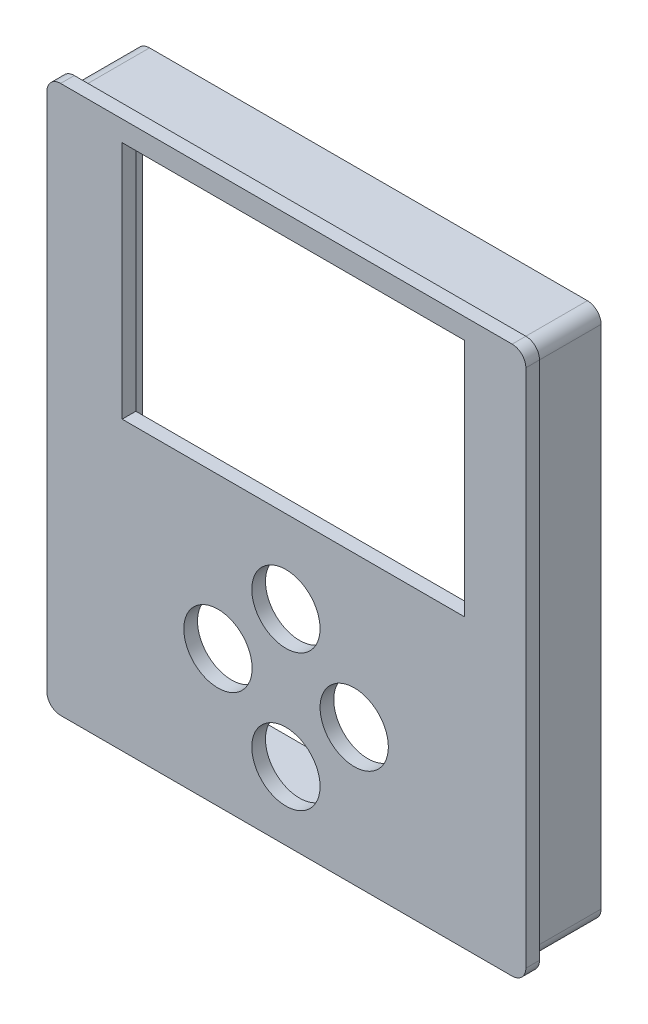
ISO-10303-21;
HEADER;
FILE_DESCRIPTION(('STEP AP214'),'2;1');
FILE_NAME('part.step','',(''),(''),'','','');
FILE_SCHEMA(('AUTOMOTIVE_DESIGN { 1 0 10303 214 1 1 1 1 }'));
ENDSEC;
DATA;
#1=APPLICATION_CONTEXT('core data for automotive mechanical design processes');
#2=APPLICATION_PROTOCOL_DEFINITION('international standard','automotive_design',2000,#1);
#3=PRODUCT_CONTEXT('',#1,'mechanical');
#4=PRODUCT('Part','Part','',(#3));
#5=PRODUCT_RELATED_PRODUCT_CATEGORY('part','',(#4));
#6=PRODUCT_DEFINITION_FORMATION('','',#4);
#7=PRODUCT_DEFINITION_CONTEXT('part definition',#1,'design');
#8=PRODUCT_DEFINITION('design','',#6,#7);
#9=PRODUCT_DEFINITION_SHAPE('','',#8);
#10=(LENGTH_UNIT() NAMED_UNIT(*) SI_UNIT(.MILLI.,.METRE.));
#11=(NAMED_UNIT(*) PLANE_ANGLE_UNIT() SI_UNIT($,.RADIAN.));
#12=(NAMED_UNIT(*) SI_UNIT($,.STERADIAN.) SOLID_ANGLE_UNIT());
#13=UNCERTAINTY_MEASURE_WITH_UNIT(LENGTH_MEASURE(1.E-05),#10,'distance_accuracy_value','');
#14=(GEOMETRIC_REPRESENTATION_CONTEXT(3) GLOBAL_UNCERTAINTY_ASSIGNED_CONTEXT((#13)) GLOBAL_UNIT_ASSIGNED_CONTEXT((#10,
#11,#12)) REPRESENTATION_CONTEXT('',''));
#15=CARTESIAN_POINT('',(0.,0.,0.));
#16=DIRECTION('',(0.,0.,1.));
#17=DIRECTION('',(1.,0.,0.));
#18=AXIS2_PLACEMENT_3D('',#15,#16,#17);
#19=CARTESIAN_POINT('',(88.9,0.,2.54));
#20=DIRECTION('',(1.,0.,0.));
#21=DIRECTION('',(0.,1.,0.));
#22=AXIS2_PLACEMENT_3D('',#19,#20,#21);
#23=PLANE('',#22);
#24=DIRECTION('',(0.,-1.,0.));
#25=VECTOR('',#24,1.);
#26=CARTESIAN_POINT('',(88.9,0.,0.));
#27=LINE('',#26,#25);
#28=CARTESIAN_POINT('',(88.9,99.06,0.));
#29=VERTEX_POINT('',#28);
#30=CARTESIAN_POINT('',(88.9,2.54000000000002,0.));
#31=VERTEX_POINT('',#30);
#32=EDGE_CURVE('E504',#29,#31,#27,.T.);
#33=ORIENTED_EDGE('',*,*,#32,.F.);
#34=DIRECTION('',(0.,0.,-1.));
#35=VECTOR('',#34,1.);
#36=CARTESIAN_POINT('',(88.9,99.06,2.54));
#37=LINE('',#36,#35);
#38=CARTESIAN_POINT('',(88.9,99.06,2.54));
#39=VERTEX_POINT('',#38);
#40=EDGE_CURVE('E11',#39,#29,#37,.T.);
#41=ORIENTED_EDGE('',*,*,#40,.F.);
#42=DIRECTION('',(0.,-1.,0.));
#43=VECTOR('',#42,1.);
#44=CARTESIAN_POINT('',(88.9,0.,2.54));
#45=LINE('',#44,#43);
#46=CARTESIAN_POINT('',(88.9,2.54000000000002,2.54));
#47=VERTEX_POINT('',#46);
#48=EDGE_CURVE('E443',#39,#47,#45,.T.);
#49=ORIENTED_EDGE('',*,*,#48,.T.);
#50=DIRECTION('',(0.,0.,-1.));
#51=VECTOR('',#50,1.);
#52=CARTESIAN_POINT('',(88.9,2.54000000000002,2.54));
#53=LINE('',#52,#51);
#54=EDGE_CURVE('E535',#47,#31,#53,.T.);
#55=ORIENTED_EDGE('',*,*,#54,.T.);
#56=EDGE_LOOP('',(#33,#41,#49,#55));
#57=FACE_BOUND('',#56,.T.);
#58=ADVANCED_FACE('F40',(#57),#23,.T.);
#59=CARTESIAN_POINT('',(86.36,99.06,2.54));
#60=DIRECTION('',(0.,0.,-1.));
#61=DIRECTION('',(-1.,0.,0.));
#62=AXIS2_PLACEMENT_3D('',#59,#60,#61);
#63=CYLINDRICAL_SURFACE('',#62,2.54);
#64=CARTESIAN_POINT('',(86.36,99.06,0.));
#65=DIRECTION('',(0.,0.,1.));
#66=DIRECTION('',(1.,0.,0.));
#67=AXIS2_PLACEMENT_3D('',#64,#65,#66);
#68=CIRCLE('',#67,2.54);
#69=CARTESIAN_POINT('',(86.36,101.6,0.));
#70=VERTEX_POINT('',#69);
#71=EDGE_CURVE('E508',#29,#70,#68,.T.);
#72=ORIENTED_EDGE('',*,*,#71,.T.);
#73=DIRECTION('',(0.,0.,-1.));
#74=VECTOR('',#73,1.);
#75=CARTESIAN_POINT('',(86.36,101.6,2.54));
#76=LINE('',#75,#74);
#77=CARTESIAN_POINT('',(86.36,101.6,2.54));
#78=VERTEX_POINT('',#77);
#79=EDGE_CURVE('E50',#78,#70,#76,.T.);
#80=ORIENTED_EDGE('',*,*,#79,.F.);
#81=CARTESIAN_POINT('',(86.36,99.06,2.54));
#82=DIRECTION('',(0.,0.,1.));
#83=DIRECTION('',(1.,0.,0.));
#84=AXIS2_PLACEMENT_3D('',#81,#82,#83);
#85=CIRCLE('',#84,2.54);
#86=EDGE_CURVE('E447',#39,#78,#85,.T.);
#87=ORIENTED_EDGE('',*,*,#86,.F.);
#88=ORIENTED_EDGE('',*,*,#40,.T.);
#89=EDGE_LOOP('',(#72,#80,#87,#88));
#90=FACE_BOUND('',#89,.T.);
#91=ADVANCED_FACE('F599',(#90),#63,.T.);
#92=CARTESIAN_POINT('',(0.,101.6,2.54));
#93=DIRECTION('',(0.,1.,0.));
#94=DIRECTION('',(0.,0.,1.));
#95=AXIS2_PLACEMENT_3D('',#92,#93,#94);
#96=PLANE('',#95);
#97=DIRECTION('',(1.,0.,0.));
#98=VECTOR('',#97,1.);
#99=CARTESIAN_POINT('',(0.,101.6,0.));
#100=LINE('',#99,#98);
#101=CARTESIAN_POINT('',(2.54000000000002,101.6,0.));
#102=VERTEX_POINT('',#101);
#103=EDGE_CURVE('E512',#102,#70,#100,.T.);
#104=ORIENTED_EDGE('',*,*,#103,.F.);
#105=DIRECTION('',(0.,0.,-1.));
#106=VECTOR('',#105,1.);
#107=CARTESIAN_POINT('',(2.54000000000002,101.6,2.54));
#108=LINE('',#107,#106);
#109=CARTESIAN_POINT('',(2.54000000000002,101.6,2.54));
#110=VERTEX_POINT('',#109);
#111=EDGE_CURVE('E551',#110,#102,#108,.T.);
#112=ORIENTED_EDGE('',*,*,#111,.F.);
#113=DIRECTION('',(1.,0.,0.));
#114=VECTOR('',#113,1.);
#115=CARTESIAN_POINT('',(0.,101.6,2.54));
#116=LINE('',#115,#114);
#117=EDGE_CURVE('E450',#110,#78,#116,.T.);
#118=ORIENTED_EDGE('',*,*,#117,.T.);
#119=ORIENTED_EDGE('',*,*,#79,.T.);
#120=EDGE_LOOP('',(#104,#112,#118,#119));
#121=FACE_BOUND('',#120,.T.);
#122=ADVANCED_FACE('F605',(#121),#96,.T.);
#123=CARTESIAN_POINT('',(2.54,99.06,2.54));
#124=DIRECTION('',(0.,0.,-1.));
#125=DIRECTION('',(-1.,0.,0.));
#126=AXIS2_PLACEMENT_3D('',#123,#124,#125);
#127=CYLINDRICAL_SURFACE('',#126,2.54);
#128=CARTESIAN_POINT('',(2.54,99.06,0.));
#129=DIRECTION('',(0.,0.,1.));
#130=DIRECTION('',(1.,0.,0.));
#131=AXIS2_PLACEMENT_3D('',#128,#129,#130);
#132=CIRCLE('',#131,2.54);
#133=CARTESIAN_POINT('',(0.,99.06,0.));
#134=VERTEX_POINT('',#133);
#135=EDGE_CURVE('E516',#102,#134,#132,.T.);
#136=ORIENTED_EDGE('',*,*,#135,.T.);
#137=DIRECTION('',(0.,0.,-1.));
#138=VECTOR('',#137,1.);
#139=CARTESIAN_POINT('',(0.,99.06,2.54));
#140=LINE('',#139,#138);
#141=CARTESIAN_POINT('',(0.,99.06,2.54));
#142=VERTEX_POINT('',#141);
#143=EDGE_CURVE('E548',#142,#134,#140,.T.);
#144=ORIENTED_EDGE('',*,*,#143,.F.);
#145=CARTESIAN_POINT('',(2.54,99.06,2.54));
#146=DIRECTION('',(0.,0.,1.));
#147=DIRECTION('',(1.,0.,0.));
#148=AXIS2_PLACEMENT_3D('',#145,#146,#147);
#149=CIRCLE('',#148,2.54);
#150=EDGE_CURVE('E454',#110,#142,#149,.T.);
#151=ORIENTED_EDGE('',*,*,#150,.F.);
#152=ORIENTED_EDGE('',*,*,#111,.T.);
#153=EDGE_LOOP('',(#136,#144,#151,#152));
#154=FACE_BOUND('',#153,.T.);
#155=ADVANCED_FACE('F656',(#154),#127,.T.);
#156=CARTESIAN_POINT('',(0.,0.,2.54));
#157=DIRECTION('',(-1.,0.,0.));
#158=DIRECTION('',(0.,0.,1.));
#159=AXIS2_PLACEMENT_3D('',#156,#157,#158);
#160=PLANE('',#159);
#161=DIRECTION('',(0.,1.,0.));
#162=VECTOR('',#161,1.);
#163=CARTESIAN_POINT('',(0.,0.,0.));
#164=LINE('',#163,#162);
#165=CARTESIAN_POINT('',(0.,2.54000000000002,0.));
#166=VERTEX_POINT('',#165);
#167=EDGE_CURVE('E520',#166,#134,#164,.T.);
#168=ORIENTED_EDGE('',*,*,#167,.F.);
#169=DIRECTION('',(0.,0.,-1.));
#170=VECTOR('',#169,1.);
#171=CARTESIAN_POINT('',(0.,2.54000000000002,2.54));
#172=LINE('',#171,#170);
#173=CARTESIAN_POINT('',(0.,2.54000000000002,2.54));
#174=VERTEX_POINT('',#173);
#175=EDGE_CURVE('E545',#174,#166,#172,.T.);
#176=ORIENTED_EDGE('',*,*,#175,.F.);
#177=DIRECTION('',(0.,1.,0.));
#178=VECTOR('',#177,1.);
#179=CARTESIAN_POINT('',(0.,0.,2.54));
#180=LINE('',#179,#178);
#181=EDGE_CURVE('E457',#174,#142,#180,.T.);
#182=ORIENTED_EDGE('',*,*,#181,.T.);
#183=ORIENTED_EDGE('',*,*,#143,.T.);
#184=EDGE_LOOP('',(#168,#176,#182,#183));
#185=FACE_BOUND('',#184,.T.);
#186=ADVANCED_FACE('F652',(#185),#160,.T.);
#187=CARTESIAN_POINT('',(2.54,2.54,2.54));
#188=DIRECTION('',(0.,0.,-1.));
#189=DIRECTION('',(-1.,0.,0.));
#190=AXIS2_PLACEMENT_3D('',#187,#188,#189);
#191=CYLINDRICAL_SURFACE('',#190,2.54);
#192=CARTESIAN_POINT('',(2.54,2.54,0.));
#193=DIRECTION('',(0.,0.,1.));
#194=DIRECTION('',(1.,0.,0.));
#195=AXIS2_PLACEMENT_3D('',#192,#193,#194);
#196=CIRCLE('',#195,2.54);
#197=CARTESIAN_POINT('',(2.54000000000002,0.,0.));
#198=VERTEX_POINT('',#197);
#199=EDGE_CURVE('E524',#198,#166,#196,.F.);
#200=ORIENTED_EDGE('',*,*,#199,.F.);
#201=DIRECTION('',(0.,0.,-1.));
#202=VECTOR('',#201,1.);
#203=CARTESIAN_POINT('',(2.54000000000002,0.,2.54));
#204=LINE('',#203,#202);
#205=CARTESIAN_POINT('',(2.54000000000002,0.,2.54));
#206=VERTEX_POINT('',#205);
#207=EDGE_CURVE('E542',#206,#198,#204,.T.);
#208=ORIENTED_EDGE('',*,*,#207,.F.);
#209=CARTESIAN_POINT('',(2.54,2.54,2.54));
#210=DIRECTION('',(0.,0.,1.));
#211=DIRECTION('',(1.,0.,0.));
#212=AXIS2_PLACEMENT_3D('',#209,#210,#211);
#213=CIRCLE('',#212,2.54);
#214=EDGE_CURVE('E461',#206,#174,#213,.F.);
#215=ORIENTED_EDGE('',*,*,#214,.T.);
#216=ORIENTED_EDGE('',*,*,#175,.T.);
#217=EDGE_LOOP('',(#200,#208,#215,#216));
#218=FACE_BOUND('',#217,.T.);
#219=ADVANCED_FACE('F648',(#218),#191,.T.);
#220=CARTESIAN_POINT('',(0.,0.,2.54));
#221=DIRECTION('',(0.,1.,0.));
#222=DIRECTION('',(0.,0.,1.));
#223=AXIS2_PLACEMENT_3D('',#220,#221,#222);
#224=PLANE('',#223);
#225=DIRECTION('',(1.,0.,0.));
#226=VECTOR('',#225,1.);
#227=CARTESIAN_POINT('',(0.,0.,0.));
#228=LINE('',#227,#226);
#229=CARTESIAN_POINT('',(86.36,0.,0.));
#230=VERTEX_POINT('',#229);
#231=EDGE_CURVE('E528',#198,#230,#228,.T.);
#232=ORIENTED_EDGE('',*,*,#231,.T.);
#233=DIRECTION('',(0.,0.,-1.));
#234=VECTOR('',#233,1.);
#235=CARTESIAN_POINT('',(86.36,0.,2.54));
#236=LINE('',#235,#234);
#237=CARTESIAN_POINT('',(86.36,0.,2.54));
#238=VERTEX_POINT('',#237);
#239=EDGE_CURVE('E538',#238,#230,#236,.T.);
#240=ORIENTED_EDGE('',*,*,#239,.F.);
#241=DIRECTION('',(1.,0.,0.));
#242=VECTOR('',#241,1.);
#243=CARTESIAN_POINT('',(0.,0.,2.54));
#244=LINE('',#243,#242);
#245=EDGE_CURVE('E465',#206,#238,#244,.T.);
#246=ORIENTED_EDGE('',*,*,#245,.F.);
#247=ORIENTED_EDGE('',*,*,#207,.T.);
#248=EDGE_LOOP('',(#232,#240,#246,#247));
#249=FACE_BOUND('',#248,.T.);
#250=ADVANCED_FACE('F645',(#249),#224,.F.);
#251=CARTESIAN_POINT('',(0.,97.79,2.54));
#252=DIRECTION('',(0.,-1.,0.));
#253=DIRECTION('',(0.,0.,-1.));
#254=AXIS2_PLACEMENT_3D('',#251,#252,#253);
#255=PLANE('',#254);
#256=DIRECTION('',(-1.,0.,0.));
#257=VECTOR('',#256,1.);
#258=CARTESIAN_POINT('',(0.,97.79,0.));
#259=LINE('',#258,#257);
#260=CARTESIAN_POINT('',(77.47,97.79,0.));
#261=VERTEX_POINT('',#260);
#262=CARTESIAN_POINT('',(13.97,97.79,0.));
#263=VERTEX_POINT('',#262);
#264=EDGE_CURVE('E476',#261,#263,#259,.T.);
#265=ORIENTED_EDGE('',*,*,#264,.F.);
#266=DIRECTION('',(0.,0.,-1.));
#267=VECTOR('',#266,1.);
#268=CARTESIAN_POINT('',(77.47,97.79,2.54));
#269=LINE('',#268,#267);
#270=CARTESIAN_POINT('',(77.47,97.79,2.54));
#271=VERTEX_POINT('',#270);
#272=EDGE_CURVE('E44',#271,#261,#269,.T.);
#273=ORIENTED_EDGE('',*,*,#272,.F.);
#274=DIRECTION('',(-1.,0.,0.));
#275=VECTOR('',#274,1.);
#276=CARTESIAN_POINT('',(0.,97.79,2.54));
#277=LINE('',#276,#275);
#278=CARTESIAN_POINT('',(13.97,97.79,2.54));
#279=VERTEX_POINT('',#278);
#280=EDGE_CURVE('E414',#271,#279,#277,.T.);
#281=ORIENTED_EDGE('',*,*,#280,.T.);
#282=DIRECTION('',(0.,0.,-1.));
#283=VECTOR('',#282,1.);
#284=CARTESIAN_POINT('',(13.97,97.79,2.54));
#285=LINE('',#284,#283);
#286=EDGE_CURVE('E472',#279,#263,#285,.T.);
#287=ORIENTED_EDGE('',*,*,#286,.T.);
#288=EDGE_LOOP('',(#265,#273,#281,#287));
#289=FACE_BOUND('',#288,.T.);
#290=ADVANCED_FACE('F572',(#289),#255,.T.);
#291=CARTESIAN_POINT('',(77.47,0.,2.54));
#292=DIRECTION('',(-1.,0.,0.));
#293=DIRECTION('',(0.,0.,1.));
#294=AXIS2_PLACEMENT_3D('',#291,#292,#293);
#295=PLANE('',#294);
#296=DIRECTION('',(0.,1.,0.));
#297=VECTOR('',#296,1.);
#298=CARTESIAN_POINT('',(77.47,0.,0.));
#299=LINE('',#298,#297);
#300=CARTESIAN_POINT('',(77.47,53.34,0.));
#301=VERTEX_POINT('',#300);
#302=EDGE_CURVE('E480',#301,#261,#299,.T.);
#303=ORIENTED_EDGE('',*,*,#302,.F.);
#304=DIRECTION('',(0.,0.,-1.));
#305=VECTOR('',#304,1.);
#306=CARTESIAN_POINT('',(77.47,53.34,2.54));
#307=LINE('',#306,#305);
#308=CARTESIAN_POINT('',(77.47,53.34,2.54));
#309=VERTEX_POINT('',#308);
#310=EDGE_CURVE('E560',#309,#301,#307,.T.);
#311=ORIENTED_EDGE('',*,*,#310,.F.);
#312=DIRECTION('',(0.,1.,0.));
#313=VECTOR('',#312,1.);
#314=CARTESIAN_POINT('',(77.47,0.,2.54));
#315=LINE('',#314,#313);
#316=EDGE_CURVE('E419',#309,#271,#315,.T.);
#317=ORIENTED_EDGE('',*,*,#316,.T.);
#318=ORIENTED_EDGE('',*,*,#272,.T.);
#319=EDGE_LOOP('',(#303,#311,#317,#318));
#320=FACE_BOUND('',#319,.T.);
#321=ADVANCED_FACE('F568',(#320),#295,.T.);
#322=CARTESIAN_POINT('',(0.,53.34,2.54));
#323=DIRECTION('',(0.,1.,0.));
#324=DIRECTION('',(0.,0.,1.));
#325=AXIS2_PLACEMENT_3D('',#322,#323,#324);
#326=PLANE('',#325);
#327=DIRECTION('',(1.,0.,0.));
#328=VECTOR('',#327,1.);
#329=CARTESIAN_POINT('',(0.,53.34,0.));
#330=LINE('',#329,#328);
#331=CARTESIAN_POINT('',(13.97,53.34,0.));
#332=VERTEX_POINT('',#331);
#333=EDGE_CURVE('E484',#332,#301,#330,.T.);
#334=ORIENTED_EDGE('',*,*,#333,.F.);
#335=DIRECTION('',(0.,0.,-1.));
#336=VECTOR('',#335,1.);
#337=CARTESIAN_POINT('',(13.97,53.34,2.54));
#338=LINE('',#337,#336);
#339=CARTESIAN_POINT('',(13.97,53.34,2.54));
#340=VERTEX_POINT('',#339);
#341=EDGE_CURVE('E558',#340,#332,#338,.T.);
#342=ORIENTED_EDGE('',*,*,#341,.F.);
#343=DIRECTION('',(1.,0.,0.));
#344=VECTOR('',#343,1.);
#345=CARTESIAN_POINT('',(0.,53.34,2.54));
#346=LINE('',#345,#344);
#347=EDGE_CURVE('E423',#340,#309,#346,.T.);
#348=ORIENTED_EDGE('',*,*,#347,.T.);
#349=ORIENTED_EDGE('',*,*,#310,.T.);
#350=EDGE_LOOP('',(#334,#342,#348,#349));
#351=FACE_BOUND('',#350,.T.);
#352=ADVANCED_FACE('F577',(#351),#326,.T.);
#353=CARTESIAN_POINT('',(44.3665980210486,12.6761708631567,2.54));
#354=DIRECTION('',(0.,0.,-1.));
#355=DIRECTION('',(-1.,0.,0.));
#356=AXIS2_PLACEMENT_3D('',#353,#354,#355);
#357=CYLINDRICAL_SURFACE('',#356,6.33808543157837);
#358=CARTESIAN_POINT('',(44.3665980210486,12.6761708631567,2.54));
#359=DIRECTION('',(0.,0.,1.));
#360=DIRECTION('',(1.,0.,0.));
#361=AXIS2_PLACEMENT_3D('',#358,#359,#360);
#362=CIRCLE('',#361,6.33808543157837);
#363=CARTESIAN_POINT('',(50.7046834526269,12.6761708631567,2.54));
#364=VERTEX_POINT('',#363);
#365=EDGE_CURVE('E439',#364,#364,#362,.T.);
#366=ORIENTED_EDGE('',*,*,#365,.T.);
#367=EDGE_LOOP('',(#366));
#368=FACE_BOUND('',#367,.T.);
#369=CARTESIAN_POINT('',(44.3665980210486,12.6761708631567,0.));
#370=DIRECTION('',(0.,0.,1.));
#371=DIRECTION('',(1.,0.,0.));
#372=AXIS2_PLACEMENT_3D('',#369,#370,#371);
#373=CIRCLE('',#372,6.33808543157837);
#374=CARTESIAN_POINT('',(50.7046834526269,12.6761708631567,0.));
#375=VERTEX_POINT('',#374);
#376=EDGE_CURVE('E500',#375,#375,#373,.T.);
#377=ORIENTED_EDGE('',*,*,#376,.F.);
#378=EDGE_LOOP('',(#377));
#379=FACE_BOUND('',#378,.T.);
#380=ADVANCED_FACE('F611',(#368,#379),#357,.F.);
#381=CARTESIAN_POINT('',(57.0427688842053,25.3523417263135,2.54));
#382=DIRECTION('',(0.,0.,-1.));
#383=DIRECTION('',(-1.,0.,0.));
#384=AXIS2_PLACEMENT_3D('',#381,#382,#383);
#385=CYLINDRICAL_SURFACE('',#384,6.33808543157837);
#386=CARTESIAN_POINT('',(57.0427688842053,25.3523417263135,2.54));
#387=DIRECTION('',(0.,0.,1.));
#388=DIRECTION('',(1.,0.,0.));
#389=AXIS2_PLACEMENT_3D('',#386,#387,#388);
#390=CIRCLE('',#389,6.33808543157837);
#391=CARTESIAN_POINT('',(63.3808543157837,25.3523417263135,2.54));
#392=VERTEX_POINT('',#391);
#393=EDGE_CURVE('E435',#392,#392,#390,.T.);
#394=ORIENTED_EDGE('',*,*,#393,.T.);
#395=EDGE_LOOP('',(#394));
#396=FACE_BOUND('',#395,.T.);
#397=CARTESIAN_POINT('',(57.0427688842053,25.3523417263135,0.));
#398=DIRECTION('',(0.,0.,1.));
#399=DIRECTION('',(1.,0.,0.));
#400=AXIS2_PLACEMENT_3D('',#397,#398,#399);
#401=CIRCLE('',#400,6.33808543157837);
#402=CARTESIAN_POINT('',(63.3808543157837,25.3523417263135,0.));
#403=VERTEX_POINT('',#402);
#404=EDGE_CURVE('E496',#403,#403,#401,.T.);
#405=ORIENTED_EDGE('',*,*,#404,.F.);
#406=EDGE_LOOP('',(#405));
#407=FACE_BOUND('',#406,.T.);
#408=ADVANCED_FACE('F594',(#396,#407),#385,.F.);
#409=CARTESIAN_POINT('',(44.3665980210486,38.0285125894702,2.54));
#410=DIRECTION('',(0.,0.,-1.));
#411=DIRECTION('',(-1.,0.,0.));
#412=AXIS2_PLACEMENT_3D('',#409,#410,#411);
#413=CYLINDRICAL_SURFACE('',#412,6.33808543157837);
#414=CARTESIAN_POINT('',(44.3665980210486,38.0285125894702,2.54));
#415=DIRECTION('',(0.,0.,1.));
#416=DIRECTION('',(1.,0.,0.));
#417=AXIS2_PLACEMENT_3D('',#414,#415,#416);
#418=CIRCLE('',#417,6.33808543157837);
#419=CARTESIAN_POINT('',(50.7046834526269,38.0285125894702,2.54));
#420=VERTEX_POINT('',#419);
#421=EDGE_CURVE('E431',#420,#420,#418,.T.);
#422=ORIENTED_EDGE('',*,*,#421,.T.);
#423=EDGE_LOOP('',(#422));
#424=FACE_BOUND('',#423,.T.);
#425=CARTESIAN_POINT('',(44.3665980210486,38.0285125894702,0.));
#426=DIRECTION('',(0.,0.,1.));
#427=DIRECTION('',(1.,0.,0.));
#428=AXIS2_PLACEMENT_3D('',#425,#426,#427);
#429=CIRCLE('',#428,6.33808543157837);
#430=CARTESIAN_POINT('',(50.7046834526269,38.0285125894702,0.));
#431=VERTEX_POINT('',#430);
#432=EDGE_CURVE('E492',#431,#431,#429,.T.);
#433=ORIENTED_EDGE('',*,*,#432,.F.);
#434=EDGE_LOOP('',(#433));
#435=FACE_BOUND('',#434,.T.);
#436=ADVANCED_FACE('F586',(#424,#435),#413,.F.);
#437=CARTESIAN_POINT('',(13.97,0.,2.54));
#438=DIRECTION('',(1.,0.,0.));
#439=DIRECTION('',(0.,0.,-1.));
#440=AXIS2_PLACEMENT_3D('',#437,#438,#439);
#441=PLANE('',#440);
#442=DIRECTION('',(0.,-1.,0.));
#443=VECTOR('',#442,1.);
#444=CARTESIAN_POINT('',(13.97,0.,0.));
#445=LINE('',#444,#443);
#446=EDGE_CURVE('E488',#263,#332,#445,.T.);
#447=ORIENTED_EDGE('',*,*,#446,.F.);
#448=ORIENTED_EDGE('',*,*,#286,.F.);
#449=DIRECTION('',(0.,-1.,0.));
#450=VECTOR('',#449,1.);
#451=CARTESIAN_POINT('',(13.97,0.,2.54));
#452=LINE('',#451,#450);
#453=EDGE_CURVE('E427',#279,#340,#452,.T.);
#454=ORIENTED_EDGE('',*,*,#453,.T.);
#455=ORIENTED_EDGE('',*,*,#341,.T.);
#456=EDGE_LOOP('',(#447,#448,#454,#455));
#457=FACE_BOUND('',#456,.T.);
#458=ADVANCED_FACE('F584',(#457),#441,.T.);
#459=CARTESIAN_POINT('',(31.75,25.3523417263135,2.54));
#460=DIRECTION('',(0.,0.,-1.));
#461=DIRECTION('',(-1.,0.,0.));
#462=AXIS2_PLACEMENT_3D('',#459,#460,#461);
#463=CYLINDRICAL_SURFACE('',#462,6.33808543157836);
#464=CARTESIAN_POINT('',(31.75,25.3523417263135,2.54));
#465=DIRECTION('',(0.,0.,1.));
#466=DIRECTION('',(1.,0.,0.));
#467=AXIS2_PLACEMENT_3D('',#464,#465,#466);
#468=CIRCLE('',#467,6.33808543157836);
#469=CARTESIAN_POINT('',(38.0880854315784,25.3523417263135,2.54));
#470=VERTEX_POINT('',#469);
#471=EDGE_CURVE('E410',#470,#470,#468,.T.);
#472=ORIENTED_EDGE('',*,*,#471,.T.);
#473=EDGE_LOOP('',(#472));
#474=FACE_BOUND('',#473,.T.);
#475=CARTESIAN_POINT('',(31.75,25.3523417263135,0.));
#476=DIRECTION('',(0.,0.,1.));
#477=DIRECTION('',(1.,0.,0.));
#478=AXIS2_PLACEMENT_3D('',#475,#476,#477);
#479=CIRCLE('',#478,6.33808543157836);
#480=CARTESIAN_POINT('',(38.0880854315784,25.3523417263135,0.));
#481=VERTEX_POINT('',#480);
#482=EDGE_CURVE('E390',#481,#481,#479,.T.);
#483=ORIENTED_EDGE('',*,*,#482,.F.);
#484=EDGE_LOOP('',(#483));
#485=FACE_BOUND('',#484,.T.);
#486=ADVANCED_FACE('F42',(#474,#485),#463,.F.);
#487=CARTESIAN_POINT('',(86.36,2.54,2.54));
#488=DIRECTION('',(0.,0.,-1.));
#489=DIRECTION('',(-1.,0.,0.));
#490=AXIS2_PLACEMENT_3D('',#487,#488,#489);
#491=CYLINDRICAL_SURFACE('',#490,2.54);
#492=CARTESIAN_POINT('',(86.36,2.54,0.));
#493=DIRECTION('',(0.,0.,1.));
#494=DIRECTION('',(1.,0.,0.));
#495=AXIS2_PLACEMENT_3D('',#492,#493,#494);
#496=CIRCLE('',#495,2.54);
#497=EDGE_CURVE('E415',#230,#31,#496,.T.);
#498=ORIENTED_EDGE('',*,*,#497,.T.);
#499=ORIENTED_EDGE('',*,*,#54,.F.);
#500=CARTESIAN_POINT('',(86.36,2.54,2.54));
#501=DIRECTION('',(0.,0.,1.));
#502=DIRECTION('',(1.,0.,0.));
#503=AXIS2_PLACEMENT_3D('',#500,#501,#502);
#504=CIRCLE('',#503,2.54);
#505=EDGE_CURVE('E469',#238,#47,#504,.T.);
#506=ORIENTED_EDGE('',*,*,#505,.F.);
#507=ORIENTED_EDGE('',*,*,#239,.T.);
#508=EDGE_LOOP('',(#498,#499,#506,#507));
#509=FACE_BOUND('',#508,.T.);
#510=ADVANCED_FACE('F592',(#509),#491,.T.);
#511=CARTESIAN_POINT('',(0.,0.,2.54));
#512=DIRECTION('',(0.,0.,1.));
#513=DIRECTION('',(1.,0.,0.));
#514=AXIS2_PLACEMENT_3D('',#511,#512,#513);
#515=PLANE('',#514);
#516=ORIENTED_EDGE('',*,*,#471,.F.);
#517=EDGE_LOOP('',(#516));
#518=FACE_BOUND('',#517,.T.);
#519=ORIENTED_EDGE('',*,*,#280,.F.);
#520=ORIENTED_EDGE('',*,*,#316,.F.);
#521=ORIENTED_EDGE('',*,*,#347,.F.);
#522=ORIENTED_EDGE('',*,*,#453,.F.);
#523=EDGE_LOOP('',(#519,#520,#521,#522));
#524=FACE_BOUND('',#523,.T.);
#525=ORIENTED_EDGE('',*,*,#421,.F.);
#526=EDGE_LOOP('',(#525));
#527=FACE_BOUND('',#526,.T.);
#528=ORIENTED_EDGE('',*,*,#393,.F.);
#529=EDGE_LOOP('',(#528));
#530=FACE_BOUND('',#529,.T.);
#531=ORIENTED_EDGE('',*,*,#365,.F.);
#532=EDGE_LOOP('',(#531));
#533=FACE_BOUND('',#532,.T.);
#534=ORIENTED_EDGE('',*,*,#48,.F.);
#535=ORIENTED_EDGE('',*,*,#86,.T.);
#536=ORIENTED_EDGE('',*,*,#117,.F.);
#537=ORIENTED_EDGE('',*,*,#150,.T.);
#538=ORIENTED_EDGE('',*,*,#181,.F.);
#539=ORIENTED_EDGE('',*,*,#214,.F.);
#540=ORIENTED_EDGE('',*,*,#245,.T.);
#541=ORIENTED_EDGE('',*,*,#505,.T.);
#542=EDGE_LOOP('',(#534,#535,#536,#537,#538,#539,#540,#541));
#543=FACE_BOUND('',#542,.T.);
#544=ADVANCED_FACE('F582',(#518,#524,#527,#530,#533,#543),#515,.T.);
#545=CARTESIAN_POINT('',(0.,0.,0.));
#546=DIRECTION('',(0.,0.,1.));
#547=DIRECTION('',(1.,0.,0.));
#548=AXIS2_PLACEMENT_3D('',#545,#546,#547);
#549=PLANE('',#548);
#550=DIRECTION('',(1.,0.,0.));
#551=VECTOR('',#550,1.);
#552=CARTESIAN_POINT('',(0.,100.33,0.));
#553=LINE('',#552,#551);
#554=CARTESIAN_POINT('',(3.81000000000002,100.33,0.));
#555=VERTEX_POINT('',#554);
#556=CARTESIAN_POINT('',(85.09,100.33,0.));
#557=VERTEX_POINT('',#556);
#558=EDGE_CURVE('E327',#555,#557,#553,.T.);
#559=ORIENTED_EDGE('',*,*,#558,.F.);
#560=CARTESIAN_POINT('',(3.81,97.79,0.));
#561=DIRECTION('',(0.,0.,-1.));
#562=DIRECTION('',(-1.,0.,0.));
#563=AXIS2_PLACEMENT_3D('',#560,#561,#562);
#564=CIRCLE('',#563,2.54);
#565=CARTESIAN_POINT('',(1.27,97.79,0.));
#566=VERTEX_POINT('',#565);
#567=EDGE_CURVE('E353',#566,#555,#564,.T.);
#568=ORIENTED_EDGE('',*,*,#567,.F.);
#569=DIRECTION('',(0.,1.,0.));
#570=VECTOR('',#569,1.);
#571=CARTESIAN_POINT('',(1.27,0.,0.));
#572=LINE('',#571,#570);
#573=CARTESIAN_POINT('',(1.27,3.81000000000002,0.));
#574=VERTEX_POINT('',#573);
#575=EDGE_CURVE('E349',#574,#566,#572,.T.);
#576=ORIENTED_EDGE('',*,*,#575,.F.);
#577=CARTESIAN_POINT('',(3.81,3.81,0.));
#578=DIRECTION('',(0.,0.,-1.));
#579=DIRECTION('',(-1.,0.,0.));
#580=AXIS2_PLACEMENT_3D('',#577,#578,#579);
#581=CIRCLE('',#580,2.54);
#582=CARTESIAN_POINT('',(3.81000000000002,1.27,0.));
#583=VERTEX_POINT('',#582);
#584=EDGE_CURVE('E345',#583,#574,#581,.T.);
#585=ORIENTED_EDGE('',*,*,#584,.F.);
#586=DIRECTION('',(-1.,0.,0.));
#587=VECTOR('',#586,1.);
#588=CARTESIAN_POINT('',(0.,1.27,0.));
#589=LINE('',#588,#587);
#590=CARTESIAN_POINT('',(72.39,1.27,0.));
#591=VERTEX_POINT('',#590);
#592=EDGE_CURVE('E342',#591,#583,#589,.T.);
#593=ORIENTED_EDGE('',*,*,#592,.F.);
#594=DIRECTION('',(0.,-1.,0.));
#595=VECTOR('',#594,1.);
#596=CARTESIAN_POINT('',(72.39,101.601,0.));
#597=LINE('',#596,#595);
#598=CARTESIAN_POINT('',(72.39,2.54,0.));
#599=VERTEX_POINT('',#598);
#600=EDGE_CURVE('E943',#599,#591,#597,.T.);
#601=ORIENTED_EDGE('',*,*,#600,.F.);
#602=DIRECTION('',(-1.,0.,0.));
#603=VECTOR('',#602,1.);
#604=CARTESIAN_POINT('',(0.,2.54,0.));
#605=LINE('',#604,#603);
#606=CARTESIAN_POINT('',(5.08000000000002,2.54,0.));
#607=VERTEX_POINT('',#606);
#608=EDGE_CURVE('E318',#599,#607,#605,.T.);
#609=ORIENTED_EDGE('',*,*,#608,.T.);
#610=CARTESIAN_POINT('',(5.08,5.08,0.));
#611=DIRECTION('',(0.,0.,-1.));
#612=DIRECTION('',(-1.,0.,0.));
#613=AXIS2_PLACEMENT_3D('',#610,#611,#612);
#614=CIRCLE('',#613,2.54);
#615=CARTESIAN_POINT('',(2.54,5.08000000000002,0.));
#616=VERTEX_POINT('',#615);
#617=EDGE_CURVE('E314',#607,#616,#614,.T.);
#618=ORIENTED_EDGE('',*,*,#617,.T.);
#619=DIRECTION('',(0.,1.,0.));
#620=VECTOR('',#619,1.);
#621=CARTESIAN_POINT('',(2.54,0.,0.));
#622=LINE('',#621,#620);
#623=CARTESIAN_POINT('',(2.54,96.52,0.));
#624=VERTEX_POINT('',#623);
#625=EDGE_CURVE('E310',#616,#624,#622,.T.);
#626=ORIENTED_EDGE('',*,*,#625,.T.);
#627=CARTESIAN_POINT('',(5.08,96.52,0.));
#628=DIRECTION('',(0.,0.,-1.));
#629=DIRECTION('',(-1.,0.,0.));
#630=AXIS2_PLACEMENT_3D('',#627,#628,#629);
#631=CIRCLE('',#630,2.54);
#632=CARTESIAN_POINT('',(5.08000000000002,99.06,0.));
#633=VERTEX_POINT('',#632);
#634=EDGE_CURVE('E306',#624,#633,#631,.T.);
#635=ORIENTED_EDGE('',*,*,#634,.T.);
#636=DIRECTION('',(1.,0.,0.));
#637=VECTOR('',#636,1.);
#638=CARTESIAN_POINT('',(0.,99.06,0.));
#639=LINE('',#638,#637);
#640=CARTESIAN_POINT('',(83.82,99.06,0.));
#641=VERTEX_POINT('',#640);
#642=EDGE_CURVE('E302',#633,#641,#639,.T.);
#643=ORIENTED_EDGE('',*,*,#642,.T.);
#644=CARTESIAN_POINT('',(83.82,96.52,0.));
#645=DIRECTION('',(0.,0.,-1.));
#646=DIRECTION('',(-1.,0.,0.));
#647=AXIS2_PLACEMENT_3D('',#644,#645,#646);
#648=CIRCLE('',#647,2.54);
#649=CARTESIAN_POINT('',(86.36,96.52,0.));
#650=VERTEX_POINT('',#649);
#651=EDGE_CURVE('E248',#641,#650,#648,.T.);
#652=ORIENTED_EDGE('',*,*,#651,.T.);
#653=DIRECTION('',(0.,-1.,0.));
#654=VECTOR('',#653,1.);
#655=CARTESIAN_POINT('',(86.36,0.,0.));
#656=LINE('',#655,#654);
#657=CARTESIAN_POINT('',(86.36,5.08000000000002,0.));
#658=VERTEX_POINT('',#657);
#659=EDGE_CURVE('E323',#650,#658,#656,.T.);
#660=ORIENTED_EDGE('',*,*,#659,.T.);
#661=CARTESIAN_POINT('',(83.82,5.08,0.));
#662=DIRECTION('',(0.,0.,-1.));
#663=DIRECTION('',(-1.,0.,0.));
#664=AXIS2_PLACEMENT_3D('',#661,#662,#663);
#665=CIRCLE('',#664,2.54);
#666=CARTESIAN_POINT('',(85.09,2.88029547438751,0.));
#667=VERTEX_POINT('',#666);
#668=EDGE_CURVE('E66',#667,#658,#665,.F.);
#669=ORIENTED_EDGE('',*,*,#668,.F.);
#670=DIRECTION('',(0.,-1.,0.));
#671=VECTOR('',#670,1.);
#672=CARTESIAN_POINT('',(85.09,101.601,0.));
#673=LINE('',#672,#671);
#674=CARTESIAN_POINT('',(85.09,1.27,0.));
#675=VERTEX_POINT('',#674);
#676=EDGE_CURVE('E245',#667,#675,#673,.T.);
#677=ORIENTED_EDGE('',*,*,#676,.T.);
#678=CARTESIAN_POINT('',(85.09,3.81,0.));
#679=DIRECTION('',(0.,0.,-1.));
#680=DIRECTION('',(-1.,0.,0.));
#681=AXIS2_PLACEMENT_3D('',#678,#679,#680);
#682=CIRCLE('',#681,2.54);
#683=CARTESIAN_POINT('',(87.63,3.81,0.));
#684=VERTEX_POINT('',#683);
#685=EDGE_CURVE('E339',#675,#684,#682,.F.);
#686=ORIENTED_EDGE('',*,*,#685,.T.);
#687=DIRECTION('',(0.,-1.,0.));
#688=VECTOR('',#687,1.);
#689=CARTESIAN_POINT('',(87.63,0.,0.));
#690=LINE('',#689,#688);
#691=CARTESIAN_POINT('',(87.63,97.79,0.));
#692=VERTEX_POINT('',#691);
#693=EDGE_CURVE('E335',#692,#684,#690,.T.);
#694=ORIENTED_EDGE('',*,*,#693,.F.);
#695=CARTESIAN_POINT('',(85.09,97.79,0.));
#696=DIRECTION('',(0.,0.,-1.));
#697=DIRECTION('',(-1.,0.,0.));
#698=AXIS2_PLACEMENT_3D('',#695,#696,#697);
#699=CIRCLE('',#698,2.54);
#700=EDGE_CURVE('E331',#557,#692,#699,.T.);
#701=ORIENTED_EDGE('',*,*,#700,.F.);
#702=EDGE_LOOP('',(#559,#568,#576,#585,#593,#601,#609,#618,#626,#635,#643,#652,#660,#669,#677,
#686,#694,#701));
#703=FACE_BOUND('',#702,.T.);
#704=ORIENTED_EDGE('',*,*,#32,.T.);
#705=ORIENTED_EDGE('',*,*,#497,.F.);
#706=ORIENTED_EDGE('',*,*,#231,.F.);
#707=ORIENTED_EDGE('',*,*,#199,.T.);
#708=ORIENTED_EDGE('',*,*,#167,.T.);
#709=ORIENTED_EDGE('',*,*,#135,.F.);
#710=ORIENTED_EDGE('',*,*,#103,.T.);
#711=ORIENTED_EDGE('',*,*,#71,.F.);
#712=EDGE_LOOP('',(#704,#705,#706,#707,#708,#709,#710,#711));
#713=FACE_BOUND('',#712,.T.);
#714=ORIENTED_EDGE('',*,*,#482,.T.);
#715=EDGE_LOOP('',(#714));
#716=FACE_BOUND('',#715,.T.);
#717=ORIENTED_EDGE('',*,*,#264,.T.);
#718=ORIENTED_EDGE('',*,*,#446,.T.);
#719=ORIENTED_EDGE('',*,*,#333,.T.);
#720=ORIENTED_EDGE('',*,*,#302,.T.);
#721=EDGE_LOOP('',(#717,#718,#719,#720));
#722=FACE_BOUND('',#721,.T.);
#723=ORIENTED_EDGE('',*,*,#432,.T.);
#724=EDGE_LOOP('',(#723));
#725=FACE_BOUND('',#724,.T.);
#726=ORIENTED_EDGE('',*,*,#404,.T.);
#727=EDGE_LOOP('',(#726));
#728=FACE_BOUND('',#727,.T.);
#729=ORIENTED_EDGE('',*,*,#376,.T.);
#730=EDGE_LOOP('',(#729));
#731=FACE_BOUND('',#730,.T.);
#732=ADVANCED_FACE('F575',(#703,#713,#716,#722,#725,#728,#731),#549,.F.);
#733=CARTESIAN_POINT('',(0.,100.33,-12.7));
#734=DIRECTION('',(0.,-1.,0.));
#735=DIRECTION('',(0.,0.,-1.));
#736=AXIS2_PLACEMENT_3D('',#733,#734,#735);
#737=PLANE('',#736);
#738=ORIENTED_EDGE('',*,*,#558,.T.);
#739=DIRECTION('',(0.,0.,1.));
#740=VECTOR('',#739,1.);
#741=CARTESIAN_POINT('',(85.09,100.33,-12.7));
#742=LINE('',#741,#740);
#743=CARTESIAN_POINT('',(85.09,100.33,-12.7));
#744=VERTEX_POINT('',#743);
#745=EDGE_CURVE('E386',#744,#557,#742,.T.);
#746=ORIENTED_EDGE('',*,*,#745,.F.);
#747=DIRECTION('',(1.,0.,0.));
#748=VECTOR('',#747,1.);
#749=CARTESIAN_POINT('',(0.,100.33,-12.7));
#750=LINE('',#749,#748);
#751=CARTESIAN_POINT('',(3.81000000000002,100.33,-12.7));
#752=VERTEX_POINT('',#751);
#753=EDGE_CURVE('E269',#752,#744,#750,.T.);
#754=ORIENTED_EDGE('',*,*,#753,.F.);
#755=DIRECTION('',(0.,0.,1.));
#756=VECTOR('',#755,1.);
#757=CARTESIAN_POINT('',(3.81000000000002,100.33,-12.7));
#758=LINE('',#757,#756);
#759=EDGE_CURVE('E358',#752,#555,#758,.T.);
#760=ORIENTED_EDGE('',*,*,#759,.T.);
#761=EDGE_LOOP('',(#738,#746,#754,#760));
#762=FACE_BOUND('',#761,.T.);
#763=ADVANCED_FACE('F625',(#762),#737,.F.);
#764=CARTESIAN_POINT('',(85.09,97.79,-12.7));
#765=DIRECTION('',(0.,0.,1.));
#766=DIRECTION('',(1.,0.,0.));
#767=AXIS2_PLACEMENT_3D('',#764,#765,#766);
#768=CYLINDRICAL_SURFACE('',#767,2.54);
#769=ORIENTED_EDGE('',*,*,#700,.T.);
#770=DIRECTION('',(0.,0.,1.));
#771=VECTOR('',#770,1.);
#772=CARTESIAN_POINT('',(87.63,97.79,-12.7));
#773=LINE('',#772,#771);
#774=CARTESIAN_POINT('',(87.63,97.79,-12.7));
#775=VERTEX_POINT('',#774);
#776=EDGE_CURVE('E382',#775,#692,#773,.T.);
#777=ORIENTED_EDGE('',*,*,#776,.F.);
#778=CARTESIAN_POINT('',(85.09,97.79,-12.7));
#779=DIRECTION('',(0.,0.,-1.));
#780=DIRECTION('',(-1.,0.,0.));
#781=AXIS2_PLACEMENT_3D('',#778,#779,#780);
#782=CIRCLE('',#781,2.54);
#783=EDGE_CURVE('E278',#744,#775,#782,.T.);
#784=ORIENTED_EDGE('',*,*,#783,.F.);
#785=ORIENTED_EDGE('',*,*,#745,.T.);
#786=EDGE_LOOP('',(#769,#777,#784,#785));
#787=FACE_BOUND('',#786,.T.);
#788=ADVANCED_FACE('F634',(#787),#768,.T.);
#789=CARTESIAN_POINT('',(87.63,0.,-12.7));
#790=DIRECTION('',(-1.,0.,0.));
#791=DIRECTION('',(0.,0.,1.));
#792=AXIS2_PLACEMENT_3D('',#789,#790,#791);
#793=PLANE('',#792);
#794=ORIENTED_EDGE('',*,*,#693,.T.);
#795=DIRECTION('',(0.,0.,1.));
#796=VECTOR('',#795,1.);
#797=CARTESIAN_POINT('',(87.63,3.81000000000002,-12.7));
#798=LINE('',#797,#796);
#799=CARTESIAN_POINT('',(87.63,3.81000000000002,-12.7));
#800=VERTEX_POINT('',#799);
#801=EDGE_CURVE('E378',#800,#684,#798,.T.);
#802=ORIENTED_EDGE('',*,*,#801,.F.);
#803=DIRECTION('',(0.,-1.,0.));
#804=VECTOR('',#803,1.);
#805=CARTESIAN_POINT('',(87.63,0.,-12.7));
#806=LINE('',#805,#804);
#807=EDGE_CURVE('E281',#775,#800,#806,.T.);
#808=ORIENTED_EDGE('',*,*,#807,.F.);
#809=ORIENTED_EDGE('',*,*,#776,.T.);
#810=EDGE_LOOP('',(#794,#802,#808,#809));
#811=FACE_BOUND('',#810,.T.);
#812=ADVANCED_FACE('F772',(#811),#793,.F.);
#813=CARTESIAN_POINT('',(85.09,3.81,-12.7));
#814=DIRECTION('',(0.,0.,1.));
#815=DIRECTION('',(1.,0.,0.));
#816=AXIS2_PLACEMENT_3D('',#813,#814,#815);
#817=CYLINDRICAL_SURFACE('',#816,2.54);
#818=ORIENTED_EDGE('',*,*,#685,.F.);
#819=DIRECTION('',(0.,0.,1.));
#820=VECTOR('',#819,1.);
#821=CARTESIAN_POINT('',(85.09,1.27,-12.7));
#822=LINE('',#821,#820);
#823=CARTESIAN_POINT('',(85.09,1.27,-12.7));
#824=VERTEX_POINT('',#823);
#825=EDGE_CURVE('E375',#824,#675,#822,.T.);
#826=ORIENTED_EDGE('',*,*,#825,.F.);
#827=CARTESIAN_POINT('',(85.09,3.81,-12.7));
#828=DIRECTION('',(0.,0.,-1.));
#829=DIRECTION('',(-1.,0.,0.));
#830=AXIS2_PLACEMENT_3D('',#827,#828,#829);
#831=CIRCLE('',#830,2.54);
#832=EDGE_CURVE('E257',#824,#800,#831,.F.);
#833=ORIENTED_EDGE('',*,*,#832,.T.);
#834=ORIENTED_EDGE('',*,*,#801,.T.);
#835=EDGE_LOOP('',(#818,#826,#833,#834));
#836=FACE_BOUND('',#835,.T.);
#837=ADVANCED_FACE('F782',(#836),#817,.T.);
#838=CARTESIAN_POINT('',(0.,1.27,-12.7));
#839=DIRECTION('',(0.,1.,0.));
#840=DIRECTION('',(0.,0.,1.));
#841=AXIS2_PLACEMENT_3D('',#838,#839,#840);
#842=PLANE('',#841);
#843=DIRECTION('',(-1.,0.,0.));
#844=VECTOR('',#843,1.);
#845=CARTESIAN_POINT('',(0.,1.27,-12.7));
#846=LINE('',#845,#844);
#847=CARTESIAN_POINT('',(72.39,1.27,-12.7));
#848=VERTEX_POINT('',#847);
#849=CARTESIAN_POINT('',(3.81000000000002,1.27,-12.7));
#850=VERTEX_POINT('',#849);
#851=EDGE_CURVE('E286',#848,#850,#846,.T.);
#852=ORIENTED_EDGE('',*,*,#851,.F.);
#853=DIRECTION('',(0.,0.,-1.));
#854=VECTOR('',#853,1.);
#855=CARTESIAN_POINT('',(72.39,1.27,0.));
#856=LINE('',#855,#854);
#857=EDGE_CURVE('E58',#591,#848,#856,.T.);
#858=ORIENTED_EDGE('',*,*,#857,.F.);
#859=ORIENTED_EDGE('',*,*,#592,.T.);
#860=DIRECTION('',(0.,0.,1.));
#861=VECTOR('',#860,1.);
#862=CARTESIAN_POINT('',(3.81000000000002,1.27,-12.7));
#863=LINE('',#862,#861);
#864=EDGE_CURVE('E371',#850,#583,#863,.T.);
#865=ORIENTED_EDGE('',*,*,#864,.F.);
#866=EDGE_LOOP('',(#852,#858,#859,#865));
#867=FACE_BOUND('',#866,.T.);
#868=ADVANCED_FACE('F796',(#867),#842,.F.);
#869=CARTESIAN_POINT('',(3.81,3.81,-12.7));
#870=DIRECTION('',(0.,0.,1.));
#871=DIRECTION('',(1.,0.,0.));
#872=AXIS2_PLACEMENT_3D('',#869,#870,#871);
#873=CYLINDRICAL_SURFACE('',#872,2.54);
#874=ORIENTED_EDGE('',*,*,#584,.T.);
#875=DIRECTION('',(0.,0.,1.));
#876=VECTOR('',#875,1.);
#877=CARTESIAN_POINT('',(1.27,3.81000000000002,-12.7));
#878=LINE('',#877,#876);
#879=CARTESIAN_POINT('',(1.27,3.81000000000002,-12.7));
#880=VERTEX_POINT('',#879);
#881=EDGE_CURVE('E367',#880,#574,#878,.T.);
#882=ORIENTED_EDGE('',*,*,#881,.F.);
#883=CARTESIAN_POINT('',(3.81,3.81,-12.7));
#884=DIRECTION('',(0.,0.,-1.));
#885=DIRECTION('',(-1.,0.,0.));
#886=AXIS2_PLACEMENT_3D('',#883,#884,#885);
#887=CIRCLE('',#886,2.54);
#888=EDGE_CURVE('E289',#850,#880,#887,.T.);
#889=ORIENTED_EDGE('',*,*,#888,.F.);
#890=ORIENTED_EDGE('',*,*,#864,.T.);
#891=EDGE_LOOP('',(#874,#882,#889,#890));
#892=FACE_BOUND('',#891,.T.);
#893=ADVANCED_FACE('F790',(#892),#873,.T.);
#894=CARTESIAN_POINT('',(1.27,0.,-12.7));
#895=DIRECTION('',(1.,0.,0.));
#896=DIRECTION('',(0.,0.,-1.));
#897=AXIS2_PLACEMENT_3D('',#894,#895,#896);
#898=PLANE('',#897);
#899=ORIENTED_EDGE('',*,*,#575,.T.);
#900=DIRECTION('',(0.,0.,1.));
#901=VECTOR('',#900,1.);
#902=CARTESIAN_POINT('',(1.27,97.79,-12.7));
#903=LINE('',#902,#901);
#904=CARTESIAN_POINT('',(1.27,97.79,-12.7));
#905=VERTEX_POINT('',#904);
#906=EDGE_CURVE('E362',#905,#566,#903,.T.);
#907=ORIENTED_EDGE('',*,*,#906,.F.);
#908=DIRECTION('',(0.,1.,0.));
#909=VECTOR('',#908,1.);
#910=CARTESIAN_POINT('',(1.27,0.,-12.7));
#911=LINE('',#910,#909);
#912=EDGE_CURVE('E292',#880,#905,#911,.T.);
#913=ORIENTED_EDGE('',*,*,#912,.F.);
#914=ORIENTED_EDGE('',*,*,#881,.T.);
#915=EDGE_LOOP('',(#899,#907,#913,#914));
#916=FACE_BOUND('',#915,.T.);
#917=ADVANCED_FACE('F795',(#916),#898,.F.);
#918=CARTESIAN_POINT('',(83.82,96.52,-12.7));
#919=DIRECTION('',(0.,0.,1.));
#920=DIRECTION('',(1.,0.,0.));
#921=AXIS2_PLACEMENT_3D('',#918,#919,#920);
#922=CYLINDRICAL_SURFACE('',#921,2.54);
#923=ORIENTED_EDGE('',*,*,#651,.F.);
#924=DIRECTION('',(0.,0.,1.));
#925=VECTOR('',#924,1.);
#926=CARTESIAN_POINT('',(83.82,99.06,-12.7));
#927=LINE('',#926,#925);
#928=CARTESIAN_POINT('',(83.82,99.06,-12.7));
#929=VERTEX_POINT('',#928);
#930=EDGE_CURVE('E363',#929,#641,#927,.T.);
#931=ORIENTED_EDGE('',*,*,#930,.F.);
#932=CARTESIAN_POINT('',(83.82,96.52,-12.7));
#933=DIRECTION('',(0.,0.,-1.));
#934=DIRECTION('',(-1.,0.,0.));
#935=AXIS2_PLACEMENT_3D('',#932,#933,#934);
#936=CIRCLE('',#935,2.54);
#937=CARTESIAN_POINT('',(86.36,96.52,-12.7));
#938=VERTEX_POINT('',#937);
#939=EDGE_CURVE('E357',#929,#938,#936,.T.);
#940=ORIENTED_EDGE('',*,*,#939,.T.);
#941=DIRECTION('',(0.,0.,1.));
#942=VECTOR('',#941,1.);
#943=CARTESIAN_POINT('',(86.36,96.52,-12.7));
#944=LINE('',#943,#942);
#945=EDGE_CURVE('E298',#938,#650,#944,.T.);
#946=ORIENTED_EDGE('',*,*,#945,.T.);
#947=EDGE_LOOP('',(#923,#931,#940,#946));
#948=FACE_BOUND('',#947,.T.);
#949=ADVANCED_FACE('F808',(#948),#922,.F.);
#950=CARTESIAN_POINT('',(0.,99.06,-12.7));
#951=DIRECTION('',(0.,-1.,0.));
#952=DIRECTION('',(0.,0.,-1.));
#953=AXIS2_PLACEMENT_3D('',#950,#951,#952);
#954=PLANE('',#953);
#955=ORIENTED_EDGE('',*,*,#642,.F.);
#956=DIRECTION('',(0.,0.,1.));
#957=VECTOR('',#956,1.);
#958=CARTESIAN_POINT('',(5.08000000000002,99.06,-12.7));
#959=LINE('',#958,#957);
#960=CARTESIAN_POINT('',(5.08000000000002,99.06,-12.7));
#961=VERTEX_POINT('',#960);
#962=EDGE_CURVE('E405',#961,#633,#959,.T.);
#963=ORIENTED_EDGE('',*,*,#962,.F.);
#964=DIRECTION('',(1.,0.,0.));
#965=VECTOR('',#964,1.);
#966=CARTESIAN_POINT('',(0.,99.06,-12.7));
#967=LINE('',#966,#965);
#968=EDGE_CURVE('E970',#961,#929,#967,.T.);
#969=ORIENTED_EDGE('',*,*,#968,.T.);
#970=ORIENTED_EDGE('',*,*,#930,.T.);
#971=EDGE_LOOP('',(#955,#963,#969,#970));
#972=FACE_BOUND('',#971,.T.);
#973=ADVANCED_FACE('F818',(#972),#954,.T.);
#974=CARTESIAN_POINT('',(5.08,96.52,-12.7));
#975=DIRECTION('',(0.,0.,1.));
#976=DIRECTION('',(1.,0.,0.));
#977=AXIS2_PLACEMENT_3D('',#974,#975,#976);
#978=CYLINDRICAL_SURFACE('',#977,2.54);
#979=ORIENTED_EDGE('',*,*,#634,.F.);
#980=DIRECTION('',(0.,0.,1.));
#981=VECTOR('',#980,1.);
#982=CARTESIAN_POINT('',(2.54,96.52,-12.7));
#983=LINE('',#982,#981);
#984=CARTESIAN_POINT('',(2.54,96.52,-12.7));
#985=VERTEX_POINT('',#984);
#986=EDGE_CURVE('E402',#985,#624,#983,.T.);
#987=ORIENTED_EDGE('',*,*,#986,.F.);
#988=CARTESIAN_POINT('',(5.08,96.52,-12.7));
#989=DIRECTION('',(0.,0.,-1.));
#990=DIRECTION('',(-1.,0.,0.));
#991=AXIS2_PLACEMENT_3D('',#988,#989,#990);
#992=CIRCLE('',#991,2.54);
#993=EDGE_CURVE('E974',#985,#961,#992,.T.);
#994=ORIENTED_EDGE('',*,*,#993,.T.);
#995=ORIENTED_EDGE('',*,*,#962,.T.);
#996=EDGE_LOOP('',(#979,#987,#994,#995));
#997=FACE_BOUND('',#996,.T.);
#998=ADVANCED_FACE('F827',(#997),#978,.F.);
#999=CARTESIAN_POINT('',(2.54,0.,-12.7));
#1000=DIRECTION('',(1.,0.,0.));
#1001=DIRECTION('',(0.,1.,0.));
#1002=AXIS2_PLACEMENT_3D('',#999,#1000,#1001);
#1003=PLANE('',#1002);
#1004=ORIENTED_EDGE('',*,*,#625,.F.);
#1005=DIRECTION('',(0.,0.,1.));
#1006=VECTOR('',#1005,1.);
#1007=CARTESIAN_POINT('',(2.54,5.08000000000002,-12.7));
#1008=LINE('',#1007,#1006);
#1009=CARTESIAN_POINT('',(2.54,5.08000000000002,-12.7));
#1010=VERTEX_POINT('',#1009);
#1011=EDGE_CURVE('E399',#1010,#616,#1008,.T.);
#1012=ORIENTED_EDGE('',*,*,#1011,.F.);
#1013=DIRECTION('',(0.,1.,0.));
#1014=VECTOR('',#1013,1.);
#1015=CARTESIAN_POINT('',(2.54,0.,-12.7));
#1016=LINE('',#1015,#1014);
#1017=EDGE_CURVE('E978',#1010,#985,#1016,.T.);
#1018=ORIENTED_EDGE('',*,*,#1017,.T.);
#1019=ORIENTED_EDGE('',*,*,#986,.T.);
#1020=EDGE_LOOP('',(#1004,#1012,#1018,#1019));
#1021=FACE_BOUND('',#1020,.T.);
#1022=ADVANCED_FACE('F837',(#1021),#1003,.T.);
#1023=CARTESIAN_POINT('',(5.08,5.08,-12.7));
#1024=DIRECTION('',(0.,0.,1.));
#1025=DIRECTION('',(1.,0.,0.));
#1026=AXIS2_PLACEMENT_3D('',#1023,#1024,#1025);
#1027=CYLINDRICAL_SURFACE('',#1026,2.54);
#1028=ORIENTED_EDGE('',*,*,#617,.F.);
#1029=DIRECTION('',(0.,0.,1.));
#1030=VECTOR('',#1029,1.);
#1031=CARTESIAN_POINT('',(5.08000000000002,2.54,-12.7));
#1032=LINE('',#1031,#1030);
#1033=CARTESIAN_POINT('',(5.08000000000002,2.54,-12.7));
#1034=VERTEX_POINT('',#1033);
#1035=EDGE_CURVE('E395',#1034,#607,#1032,.T.);
#1036=ORIENTED_EDGE('',*,*,#1035,.F.);
#1037=CARTESIAN_POINT('',(5.08,5.08,-12.7));
#1038=DIRECTION('',(0.,0.,-1.));
#1039=DIRECTION('',(-1.,0.,0.));
#1040=AXIS2_PLACEMENT_3D('',#1037,#1038,#1039);
#1041=CIRCLE('',#1040,2.54);
#1042=EDGE_CURVE('E271',#1034,#1010,#1041,.T.);
#1043=ORIENTED_EDGE('',*,*,#1042,.T.);
#1044=ORIENTED_EDGE('',*,*,#1011,.T.);
#1045=EDGE_LOOP('',(#1028,#1036,#1043,#1044));
#1046=FACE_BOUND('',#1045,.T.);
#1047=ADVANCED_FACE('F847',(#1046),#1027,.F.);
#1048=CARTESIAN_POINT('',(0.,2.54,-12.7));
#1049=DIRECTION('',(0.,1.,0.));
#1050=DIRECTION('',(0.,0.,1.));
#1051=AXIS2_PLACEMENT_3D('',#1048,#1049,#1050);
#1052=PLANE('',#1051);
#1053=DIRECTION('',(0.,0.,-1.));
#1054=VECTOR('',#1053,1.);
#1055=CARTESIAN_POINT('',(72.39,2.54,0.));
#1056=LINE('',#1055,#1054);
#1057=CARTESIAN_POINT('',(72.39,2.54,-12.7));
#1058=VERTEX_POINT('',#1057);
#1059=EDGE_CURVE('E945',#599,#1058,#1056,.T.);
#1060=ORIENTED_EDGE('',*,*,#1059,.T.);
#1061=DIRECTION('',(-1.,0.,0.));
#1062=VECTOR('',#1061,1.);
#1063=CARTESIAN_POINT('',(0.,2.54,-12.7));
#1064=LINE('',#1063,#1062);
#1065=EDGE_CURVE('E265',#1058,#1034,#1064,.T.);
#1066=ORIENTED_EDGE('',*,*,#1065,.T.);
#1067=ORIENTED_EDGE('',*,*,#1035,.T.);
#1068=ORIENTED_EDGE('',*,*,#608,.F.);
#1069=EDGE_LOOP('',(#1060,#1066,#1067,#1068));
#1070=FACE_BOUND('',#1069,.T.);
#1071=ADVANCED_FACE('F857',(#1070),#1052,.T.);
#1072=CARTESIAN_POINT('',(83.82,5.08,-12.7));
#1073=DIRECTION('',(0.,0.,1.));
#1074=DIRECTION('',(1.,0.,0.));
#1075=AXIS2_PLACEMENT_3D('',#1072,#1073,#1074);
#1076=CYLINDRICAL_SURFACE('',#1075,2.54);
#1077=CARTESIAN_POINT('',(83.82,5.08,-12.7));
#1078=DIRECTION('',(0.,0.,-1.));
#1079=DIRECTION('',(-1.,0.,0.));
#1080=AXIS2_PLACEMENT_3D('',#1077,#1078,#1079);
#1081=CIRCLE('',#1080,2.54);
#1082=CARTESIAN_POINT('',(85.09,2.8802954743875,-12.7));
#1083=VERTEX_POINT('',#1082);
#1084=CARTESIAN_POINT('',(86.36,5.08000000000002,-12.7));
#1085=VERTEX_POINT('',#1084);
#1086=EDGE_CURVE('E255',#1083,#1085,#1081,.F.);
#1087=ORIENTED_EDGE('',*,*,#1086,.F.);
#1088=DIRECTION('',(0.,0.,1.));
#1089=VECTOR('',#1088,1.);
#1090=CARTESIAN_POINT('',(85.09,2.88029547438751,-12.7));
#1091=LINE('',#1090,#1089);
#1092=EDGE_CURVE('E239',#667,#1083,#1091,.F.);
#1093=ORIENTED_EDGE('',*,*,#1092,.F.);
#1094=ORIENTED_EDGE('',*,*,#668,.T.);
#1095=DIRECTION('',(0.,0.,1.));
#1096=VECTOR('',#1095,1.);
#1097=CARTESIAN_POINT('',(86.36,5.08000000000002,-12.7));
#1098=LINE('',#1097,#1096);
#1099=EDGE_CURVE('E261',#1085,#658,#1098,.T.);
#1100=ORIENTED_EDGE('',*,*,#1099,.F.);
#1101=EDGE_LOOP('',(#1087,#1093,#1094,#1100));
#1102=FACE_BOUND('',#1101,.T.);
#1103=ADVANCED_FACE('F260',(#1102),#1076,.F.);
#1104=CARTESIAN_POINT('',(86.36,0.,-12.7));
#1105=DIRECTION('',(-1.,0.,0.));
#1106=DIRECTION('',(0.,-1.,0.));
#1107=AXIS2_PLACEMENT_3D('',#1104,#1105,#1106);
#1108=PLANE('',#1107);
#1109=ORIENTED_EDGE('',*,*,#659,.F.);
#1110=ORIENTED_EDGE('',*,*,#945,.F.);
#1111=DIRECTION('',(0.,-1.,0.));
#1112=VECTOR('',#1111,1.);
#1113=CARTESIAN_POINT('',(86.36,0.,-12.7));
#1114=LINE('',#1113,#1112);
#1115=EDGE_CURVE('E264',#938,#1085,#1114,.T.);
#1116=ORIENTED_EDGE('',*,*,#1115,.T.);
#1117=ORIENTED_EDGE('',*,*,#1099,.T.);
#1118=EDGE_LOOP('',(#1109,#1110,#1116,#1117));
#1119=FACE_BOUND('',#1118,.T.);
#1120=ADVANCED_FACE('F865',(#1119),#1108,.T.);
#1121=CARTESIAN_POINT('',(3.81,97.79,-12.7));
#1122=DIRECTION('',(0.,0.,1.));
#1123=DIRECTION('',(1.,0.,0.));
#1124=AXIS2_PLACEMENT_3D('',#1121,#1122,#1123);
#1125=CYLINDRICAL_SURFACE('',#1124,2.54);
#1126=ORIENTED_EDGE('',*,*,#567,.T.);
#1127=ORIENTED_EDGE('',*,*,#759,.F.);
#1128=CARTESIAN_POINT('',(3.81,97.79,-12.7));
#1129=DIRECTION('',(0.,0.,-1.));
#1130=DIRECTION('',(-1.,0.,0.));
#1131=AXIS2_PLACEMENT_3D('',#1128,#1129,#1130);
#1132=CIRCLE('',#1131,2.54);
#1133=EDGE_CURVE('E295',#905,#752,#1132,.T.);
#1134=ORIENTED_EDGE('',*,*,#1133,.F.);
#1135=ORIENTED_EDGE('',*,*,#906,.T.);
#1136=EDGE_LOOP('',(#1126,#1127,#1134,#1135));
#1137=FACE_BOUND('',#1136,.T.);
#1138=ADVANCED_FACE('F870',(#1137),#1125,.T.);
#1139=CARTESIAN_POINT('',(0.,0.,-12.7));
#1140=DIRECTION('',(0.,0.,-1.));
#1141=DIRECTION('',(-1.,0.,0.));
#1142=AXIS2_PLACEMENT_3D('',#1139,#1140,#1141);
#1143=PLANE('',#1142);
#1144=DIRECTION('',(0.,-1.,0.));
#1145=VECTOR('',#1144,1.);
#1146=CARTESIAN_POINT('',(85.09,101.601,-12.7));
#1147=LINE('',#1146,#1145);
#1148=EDGE_CURVE('E243',#1083,#824,#1147,.T.);
#1149=ORIENTED_EDGE('',*,*,#1148,.F.);
#1150=ORIENTED_EDGE('',*,*,#1086,.T.);
#1151=ORIENTED_EDGE('',*,*,#1115,.F.);
#1152=ORIENTED_EDGE('',*,*,#939,.F.);
#1153=ORIENTED_EDGE('',*,*,#968,.F.);
#1154=ORIENTED_EDGE('',*,*,#993,.F.);
#1155=ORIENTED_EDGE('',*,*,#1017,.F.);
#1156=ORIENTED_EDGE('',*,*,#1042,.F.);
#1157=ORIENTED_EDGE('',*,*,#1065,.F.);
#1158=DIRECTION('',(0.,-1.,0.));
#1159=VECTOR('',#1158,1.);
#1160=CARTESIAN_POINT('',(72.39,101.601,-12.7));
#1161=LINE('',#1160,#1159);
#1162=EDGE_CURVE('E249',#1058,#848,#1161,.T.);
#1163=ORIENTED_EDGE('',*,*,#1162,.T.);
#1164=ORIENTED_EDGE('',*,*,#851,.T.);
#1165=ORIENTED_EDGE('',*,*,#888,.T.);
#1166=ORIENTED_EDGE('',*,*,#912,.T.);
#1167=ORIENTED_EDGE('',*,*,#1133,.T.);
#1168=ORIENTED_EDGE('',*,*,#753,.T.);
#1169=ORIENTED_EDGE('',*,*,#783,.T.);
#1170=ORIENTED_EDGE('',*,*,#807,.T.);
#1171=ORIENTED_EDGE('',*,*,#832,.F.);
#1172=EDGE_LOOP('',(#1149,#1150,#1151,#1152,#1153,#1154,#1155,#1156,#1157,#1163,#1164,#1165,
#1166,#1167,#1168,#1169,#1170,#1171));
#1173=FACE_BOUND('',#1172,.T.);
#1174=ADVANCED_FACE('F253',(#1173),#1143,.T.);
#1175=CARTESIAN_POINT('',(85.09,101.601,-12.7));
#1176=DIRECTION('',(1.,0.,0.));
#1177=DIRECTION('',(0.,0.,-1.));
#1178=AXIS2_PLACEMENT_3D('',#1175,#1176,#1177);
#1179=PLANE('',#1178);
#1180=ORIENTED_EDGE('',*,*,#1092,.T.);
#1181=ORIENTED_EDGE('',*,*,#1148,.T.);
#1182=ORIENTED_EDGE('',*,*,#825,.T.);
#1183=ORIENTED_EDGE('',*,*,#676,.F.);
#1184=EDGE_LOOP('',(#1180,#1181,#1182,#1183));
#1185=FACE_BOUND('',#1184,.T.);
#1186=ADVANCED_FACE('F241',(#1185),#1179,.F.);
#1187=CARTESIAN_POINT('',(72.39,101.601,0.));
#1188=DIRECTION('',(-1.,0.,0.));
#1189=DIRECTION('',(0.,0.,1.));
#1190=AXIS2_PLACEMENT_3D('',#1187,#1188,#1189);
#1191=PLANE('',#1190);
#1192=ORIENTED_EDGE('',*,*,#600,.T.);
#1193=ORIENTED_EDGE('',*,*,#857,.T.);
#1194=ORIENTED_EDGE('',*,*,#1162,.F.);
#1195=ORIENTED_EDGE('',*,*,#1059,.F.);
#1196=EDGE_LOOP('',(#1192,#1193,#1194,#1195));
#1197=FACE_BOUND('',#1196,.T.);
#1198=ADVANCED_FACE('F930',(#1197),#1191,.F.);
#1199=CLOSED_SHELL('',(#58,#91,#122,#155,#186,#219,#250,#290,#321,#352,#380,#408,#436,#458,#486,
#510,#544,#732,#763,#788,#812,#837,#868,#893,#917,#949,#973,#998,#1022,#1047,#1071,#1103,#1120,
#1138,#1174,#1186,#1198));
#1200=MANIFOLD_SOLID_BREP('B2',#1199);
#1201=ADVANCED_BREP_SHAPE_REPRESENTATION('',(#18,#1200),#14);
#1202=SHAPE_DEFINITION_REPRESENTATION(#9,#1201);
ENDSEC;
END-ISO-10303-21;
